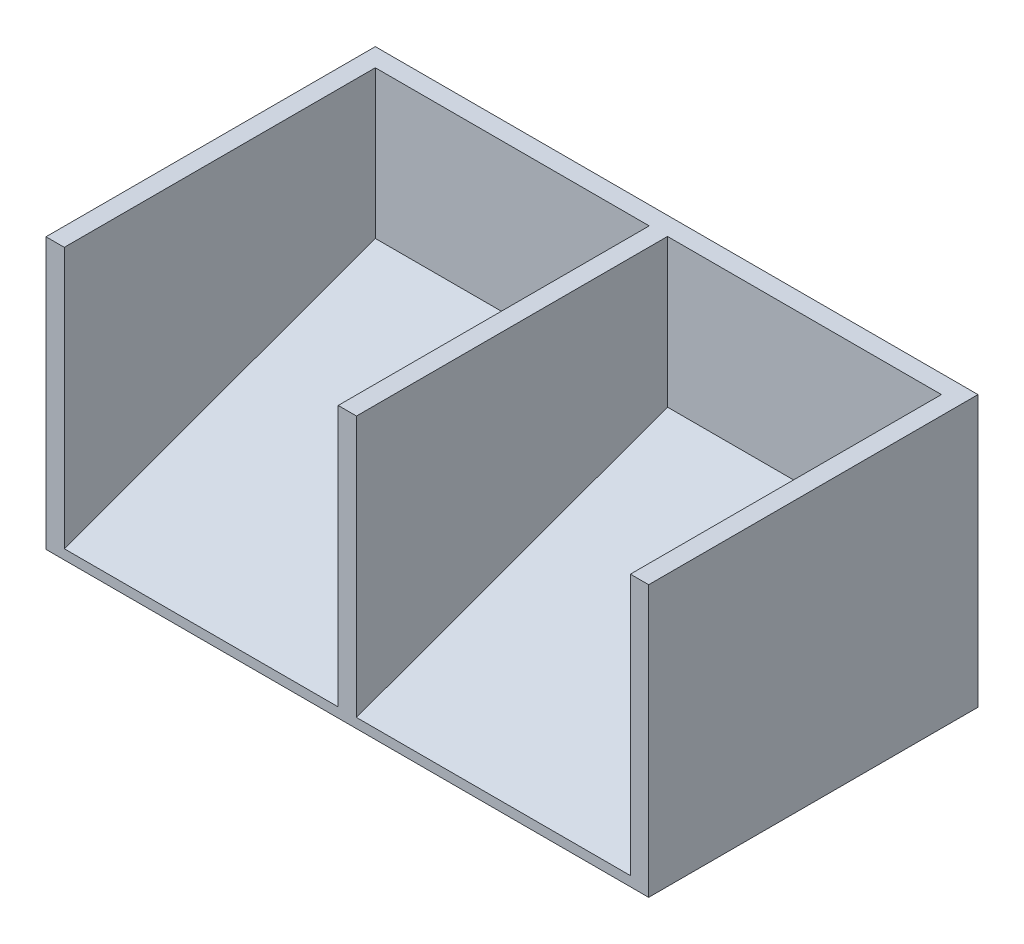
ISO-10303-21;
HEADER;
FILE_DESCRIPTION(('STEP AP214'),'2;1');
FILE_NAME('part.step','',(''),(''),'','','');
FILE_SCHEMA(('AUTOMOTIVE_DESIGN { 1 0 10303 214 1 1 1 1 }'));
ENDSEC;
DATA;
#1=APPLICATION_CONTEXT('core data for automotive mechanical design processes');
#2=APPLICATION_PROTOCOL_DEFINITION('international standard','automotive_design',2000,#1);
#3=PRODUCT_CONTEXT('',#1,'mechanical');
#4=PRODUCT('Part','Part','',(#3));
#5=PRODUCT_RELATED_PRODUCT_CATEGORY('part','',(#4));
#6=PRODUCT_DEFINITION_FORMATION('','',#4);
#7=PRODUCT_DEFINITION_CONTEXT('part definition',#1,'design');
#8=PRODUCT_DEFINITION('design','',#6,#7);
#9=PRODUCT_DEFINITION_SHAPE('','',#8);
#10=(LENGTH_UNIT() NAMED_UNIT(*) SI_UNIT(.MILLI.,.METRE.));
#11=(NAMED_UNIT(*) PLANE_ANGLE_UNIT() SI_UNIT($,.RADIAN.));
#12=(NAMED_UNIT(*) SI_UNIT($,.STERADIAN.) SOLID_ANGLE_UNIT());
#13=UNCERTAINTY_MEASURE_WITH_UNIT(LENGTH_MEASURE(1.E-05),#10,'distance_accuracy_value','');
#14=(GEOMETRIC_REPRESENTATION_CONTEXT(3) GLOBAL_UNCERTAINTY_ASSIGNED_CONTEXT((#13)) GLOBAL_UNIT_ASSIGNED_CONTEXT((#10,
#11,#12)) REPRESENTATION_CONTEXT('',''));
#15=CARTESIAN_POINT('',(0.,0.,0.));
#16=DIRECTION('',(0.,0.,1.));
#17=DIRECTION('',(1.,0.,0.));
#18=AXIS2_PLACEMENT_3D('',#15,#16,#17);
#19=CARTESIAN_POINT('',(104.5845,93.98,57.15));
#20=DIRECTION('',(-1.,0.,0.));
#21=DIRECTION('',(0.,0.,1.));
#22=AXIS2_PLACEMENT_3D('',#19,#20,#21);
#23=PLANE('',#22);
#24=DIRECTION('',(0.,0.,-1.));
#25=VECTOR('',#24,1.);
#26=CARTESIAN_POINT('',(104.5845,0.,57.15));
#27=LINE('',#26,#25);
#28=CARTESIAN_POINT('',(104.5845,0.,57.15));
#29=VERTEX_POINT('',#28);
#30=CARTESIAN_POINT('',(104.5845,0.,-57.15));
#31=VERTEX_POINT('',#30);
#32=EDGE_CURVE('E240',#29,#31,#27,.T.);
#33=ORIENTED_EDGE('',*,*,#32,.T.);
#34=DIRECTION('',(0.,-1.,0.));
#35=VECTOR('',#34,1.);
#36=CARTESIAN_POINT('',(104.5845,93.98,-57.15));
#37=LINE('',#36,#35);
#38=CARTESIAN_POINT('',(104.5845,93.98,-57.15));
#39=VERTEX_POINT('',#38);
#40=EDGE_CURVE('E12',#39,#31,#37,.T.);
#41=ORIENTED_EDGE('',*,*,#40,.F.);
#42=DIRECTION('',(0.,0.,-1.));
#43=VECTOR('',#42,1.);
#44=CARTESIAN_POINT('',(104.5845,93.98,57.15));
#45=LINE('',#44,#43);
#46=CARTESIAN_POINT('',(104.5845,93.98,57.15));
#47=VERTEX_POINT('',#46);
#48=EDGE_CURVE('E269',#47,#39,#45,.T.);
#49=ORIENTED_EDGE('',*,*,#48,.F.);
#50=DIRECTION('',(0.,-1.,0.));
#51=VECTOR('',#50,1.);
#52=CARTESIAN_POINT('',(104.5845,93.98,57.15));
#53=LINE('',#52,#51);
#54=EDGE_CURVE('E281',#47,#29,#53,.T.);
#55=ORIENTED_EDGE('',*,*,#54,.T.);
#56=EDGE_LOOP('',(#33,#41,#49,#55));
#57=FACE_BOUND('',#56,.T.);
#58=ADVANCED_FACE('F39',(#57),#23,.F.);
#59=CARTESIAN_POINT('',(-104.5845,93.98,-57.15));
#60=DIRECTION('',(0.,0.,1.));
#61=DIRECTION('',(1.,0.,0.));
#62=AXIS2_PLACEMENT_3D('',#59,#60,#61);
#63=PLANE('',#62);
#64=DIRECTION('',(-1.,0.,0.));
#65=VECTOR('',#64,1.);
#66=CARTESIAN_POINT('',(-104.5845,0.,-57.15));
#67=LINE('',#66,#65);
#68=CARTESIAN_POINT('',(-104.5845,0.,-57.15));
#69=VERTEX_POINT('',#68);
#70=EDGE_CURVE('E285',#31,#69,#67,.T.);
#71=ORIENTED_EDGE('',*,*,#70,.T.);
#72=DIRECTION('',(0.,-1.,0.));
#73=VECTOR('',#72,1.);
#74=CARTESIAN_POINT('',(-104.5845,93.98,-57.15));
#75=LINE('',#74,#73);
#76=CARTESIAN_POINT('',(-104.5845,93.98,-57.15));
#77=VERTEX_POINT('',#76);
#78=EDGE_CURVE('E46',#77,#69,#75,.T.);
#79=ORIENTED_EDGE('',*,*,#78,.F.);
#80=DIRECTION('',(-1.,0.,0.));
#81=VECTOR('',#80,1.);
#82=CARTESIAN_POINT('',(-104.5845,93.98,-57.15));
#83=LINE('',#82,#81);
#84=EDGE_CURVE('E272',#39,#77,#83,.T.);
#85=ORIENTED_EDGE('',*,*,#84,.F.);
#86=ORIENTED_EDGE('',*,*,#40,.T.);
#87=EDGE_LOOP('',(#71,#79,#85,#86));
#88=FACE_BOUND('',#87,.T.);
#89=ADVANCED_FACE('F322',(#88),#63,.F.);
#90=CARTESIAN_POINT('',(-104.5845,93.98,57.15));
#91=DIRECTION('',(1.,0.,0.));
#92=DIRECTION('',(0.,0.,-1.));
#93=AXIS2_PLACEMENT_3D('',#90,#91,#92);
#94=PLANE('',#93);
#95=DIRECTION('',(0.,0.,1.));
#96=VECTOR('',#95,1.);
#97=CARTESIAN_POINT('',(-104.5845,0.,57.15));
#98=LINE('',#97,#96);
#99=CARTESIAN_POINT('',(-104.5845,0.,57.15));
#100=VERTEX_POINT('',#99);
#101=EDGE_CURVE('E287',#69,#100,#98,.T.);
#102=ORIENTED_EDGE('',*,*,#101,.T.);
#103=DIRECTION('',(0.,-1.,0.));
#104=VECTOR('',#103,1.);
#105=CARTESIAN_POINT('',(-104.5845,93.98,57.15));
#106=LINE('',#105,#104);
#107=CARTESIAN_POINT('',(-104.5845,93.98,57.15));
#108=VERTEX_POINT('',#107);
#109=EDGE_CURVE('E295',#108,#100,#106,.T.);
#110=ORIENTED_EDGE('',*,*,#109,.F.);
#111=DIRECTION('',(0.,0.,1.));
#112=VECTOR('',#111,1.);
#113=CARTESIAN_POINT('',(-104.5845,93.98,57.15));
#114=LINE('',#113,#112);
#115=EDGE_CURVE('E275',#77,#108,#114,.T.);
#116=ORIENTED_EDGE('',*,*,#115,.F.);
#117=ORIENTED_EDGE('',*,*,#78,.T.);
#118=EDGE_LOOP('',(#102,#110,#116,#117));
#119=FACE_BOUND('',#118,.T.);
#120=ADVANCED_FACE('F302',(#119),#94,.F.);
#121=CARTESIAN_POINT('',(-104.5845,93.98,57.15));
#122=DIRECTION('',(0.,0.,-1.));
#123=DIRECTION('',(-1.,0.,0.));
#124=AXIS2_PLACEMENT_3D('',#121,#122,#123);
#125=PLANE('',#124);
#126=DIRECTION('',(1.,0.,0.));
#127=VECTOR('',#126,1.);
#128=CARTESIAN_POINT('',(-104.5845,93.98,57.15));
#129=LINE('',#128,#127);
#130=CARTESIAN_POINT('',(-3.175,93.98,57.15));
#131=VERTEX_POINT('',#130);
#132=CARTESIAN_POINT('',(3.17500000000002,93.98,57.15));
#133=VERTEX_POINT('',#132);
#134=EDGE_CURVE('E282',#131,#133,#129,.T.);
#135=ORIENTED_EDGE('',*,*,#134,.F.);
#136=DIRECTION('',(0.,1.,0.));
#137=VECTOR('',#136,1.);
#138=CARTESIAN_POINT('',(-3.175,-128.60504852733,57.15));
#139=LINE('',#138,#137);
#140=CARTESIAN_POINT('',(-3.175,3.37876442761104,57.15));
#141=VERTEX_POINT('',#140);
#142=EDGE_CURVE('E222',#141,#131,#139,.T.);
#143=ORIENTED_EDGE('',*,*,#142,.F.);
#144=DIRECTION('',(1.,0.,0.));
#145=VECTOR('',#144,1.);
#146=CARTESIAN_POINT('',(-98.2345,3.37876442761104,57.15));
#147=LINE('',#146,#145);
#148=CARTESIAN_POINT('',(-98.2345,3.37876442761104,57.15));
#149=VERTEX_POINT('',#148);
#150=EDGE_CURVE('E213',#149,#141,#147,.T.);
#151=ORIENTED_EDGE('',*,*,#150,.F.);
#152=DIRECTION('',(0.,1.,0.));
#153=VECTOR('',#152,1.);
#154=CARTESIAN_POINT('',(-98.2345,-128.60504852733,57.15));
#155=LINE('',#154,#153);
#156=CARTESIAN_POINT('',(-98.2345,93.98,57.15));
#157=VERTEX_POINT('',#156);
#158=EDGE_CURVE('E225',#149,#157,#155,.T.);
#159=ORIENTED_EDGE('',*,*,#158,.T.);
#160=EDGE_CURVE('E278',#108,#157,#129,.T.);
#161=ORIENTED_EDGE('',*,*,#160,.F.);
#162=ORIENTED_EDGE('',*,*,#109,.T.);
#163=DIRECTION('',(1.,0.,0.));
#164=VECTOR('',#163,1.);
#165=CARTESIAN_POINT('',(-104.5845,0.,57.15));
#166=LINE('',#165,#164);
#167=CARTESIAN_POINT('',(-98.2345,0.,57.15));
#168=VERTEX_POINT('',#167);
#169=EDGE_CURVE('E273',#100,#168,#166,.T.);
#170=ORIENTED_EDGE('',*,*,#169,.T.);
#171=DIRECTION('',(-1.,0.,0.));
#172=VECTOR('',#171,1.);
#173=CARTESIAN_POINT('',(-3.17500000000003,0.,57.15));
#174=LINE('',#173,#172);
#175=CARTESIAN_POINT('',(-3.17500000000003,0.,57.15));
#176=VERTEX_POINT('',#175);
#177=EDGE_CURVE('E202',#176,#168,#174,.T.);
#178=ORIENTED_EDGE('',*,*,#177,.F.);
#179=CARTESIAN_POINT('',(3.17499999999997,0.,57.15));
#180=VERTEX_POINT('',#179);
#181=EDGE_CURVE('E292',#176,#180,#166,.T.);
#182=ORIENTED_EDGE('',*,*,#181,.T.);
#183=DIRECTION('',(-1.,0.,0.));
#184=VECTOR('',#183,1.);
#185=CARTESIAN_POINT('',(98.2345,0.,57.15));
#186=LINE('',#185,#184);
#187=CARTESIAN_POINT('',(98.2345,0.,57.15));
#188=VERTEX_POINT('',#187);
#189=EDGE_CURVE('E183',#188,#180,#186,.T.);
#190=ORIENTED_EDGE('',*,*,#189,.F.);
#191=EDGE_CURVE('E289',#188,#29,#166,.T.);
#192=ORIENTED_EDGE('',*,*,#191,.T.);
#193=ORIENTED_EDGE('',*,*,#54,.F.);
#194=CARTESIAN_POINT('',(98.2345,93.98,57.15));
#195=VERTEX_POINT('',#194);
#196=EDGE_CURVE('E277',#195,#47,#129,.T.);
#197=ORIENTED_EDGE('',*,*,#196,.F.);
#198=DIRECTION('',(0.,1.,0.));
#199=VECTOR('',#198,1.);
#200=CARTESIAN_POINT('',(98.2345,-128.60504852733,57.15));
#201=LINE('',#200,#199);
#202=CARTESIAN_POINT('',(98.2345,3.37876442761104,57.15));
#203=VERTEX_POINT('',#202);
#204=EDGE_CURVE('E246',#203,#195,#201,.T.);
#205=ORIENTED_EDGE('',*,*,#204,.F.);
#206=DIRECTION('',(1.,0.,0.));
#207=VECTOR('',#206,1.);
#208=CARTESIAN_POINT('',(3.17500000000002,3.37876442761104,57.15));
#209=LINE('',#208,#207);
#210=CARTESIAN_POINT('',(3.17500000000002,3.37876442761104,57.15));
#211=VERTEX_POINT('',#210);
#212=EDGE_CURVE('E248',#211,#203,#209,.T.);
#213=ORIENTED_EDGE('',*,*,#212,.F.);
#214=DIRECTION('',(0.,1.,0.));
#215=VECTOR('',#214,1.);
#216=CARTESIAN_POINT('',(3.17500000000002,-128.60504852733,57.15));
#217=LINE('',#216,#215);
#218=EDGE_CURVE('E241',#211,#133,#217,.T.);
#219=ORIENTED_EDGE('',*,*,#218,.T.);
#220=EDGE_LOOP('',(#135,#143,#151,#159,#161,#162,#170,#178,#182,#190,#192,#193,#197,#205,#213,#219));
#221=FACE_BOUND('',#220,.T.);
#222=ADVANCED_FACE('F312',(#221),#125,.F.);
#223=CARTESIAN_POINT('',(0.,93.98,0.));
#224=DIRECTION('',(0.,-1.,0.));
#225=DIRECTION('',(0.,0.,-1.));
#226=AXIS2_PLACEMENT_3D('',#223,#224,#225);
#227=PLANE('',#226);
#228=DIRECTION('',(-1.,0.,0.));
#229=VECTOR('',#228,1.);
#230=CARTESIAN_POINT('',(-98.2345,93.98,-50.8));
#231=LINE('',#230,#229);
#232=CARTESIAN_POINT('',(-3.17500000000004,93.98,-50.8));
#233=VERTEX_POINT('',#232);
#234=CARTESIAN_POINT('',(-98.2345,93.98,-50.8));
#235=VERTEX_POINT('',#234);
#236=EDGE_CURVE('E211',#233,#235,#231,.T.);
#237=ORIENTED_EDGE('',*,*,#236,.F.);
#238=DIRECTION('',(0.,0.,-1.));
#239=VECTOR('',#238,1.);
#240=CARTESIAN_POINT('',(-3.175,93.98,57.15));
#241=LINE('',#240,#239);
#242=EDGE_CURVE('E214',#131,#233,#241,.T.);
#243=ORIENTED_EDGE('',*,*,#242,.F.);
#244=ORIENTED_EDGE('',*,*,#134,.T.);
#245=DIRECTION('',(0.,0.,1.));
#246=VECTOR('',#245,1.);
#247=CARTESIAN_POINT('',(3.17500000000002,93.98,57.15));
#248=LINE('',#247,#246);
#249=CARTESIAN_POINT('',(3.17500000000002,93.98,-50.8));
#250=VERTEX_POINT('',#249);
#251=EDGE_CURVE('E219',#250,#133,#248,.T.);
#252=ORIENTED_EDGE('',*,*,#251,.F.);
#253=DIRECTION('',(-1.,0.,0.));
#254=VECTOR('',#253,1.);
#255=CARTESIAN_POINT('',(3.17500000000002,93.98,-50.8));
#256=LINE('',#255,#254);
#257=CARTESIAN_POINT('',(98.2345,93.98,-50.8));
#258=VERTEX_POINT('',#257);
#259=EDGE_CURVE('E263',#258,#250,#256,.T.);
#260=ORIENTED_EDGE('',*,*,#259,.F.);
#261=DIRECTION('',(0.,0.,-1.));
#262=VECTOR('',#261,1.);
#263=CARTESIAN_POINT('',(98.2345,93.98,57.15));
#264=LINE('',#263,#262);
#265=EDGE_CURVE('E265',#195,#258,#264,.T.);
#266=ORIENTED_EDGE('',*,*,#265,.F.);
#267=ORIENTED_EDGE('',*,*,#196,.T.);
#268=ORIENTED_EDGE('',*,*,#48,.T.);
#269=ORIENTED_EDGE('',*,*,#84,.T.);
#270=ORIENTED_EDGE('',*,*,#115,.T.);
#271=ORIENTED_EDGE('',*,*,#160,.T.);
#272=DIRECTION('',(0.,0.,1.));
#273=VECTOR('',#272,1.);
#274=CARTESIAN_POINT('',(-98.2345,93.98,57.15));
#275=LINE('',#274,#273);
#276=EDGE_CURVE('E217',#235,#157,#275,.T.);
#277=ORIENTED_EDGE('',*,*,#276,.F.);
#278=EDGE_LOOP('',(#237,#243,#244,#252,#260,#266,#267,#268,#269,#270,#271,#277));
#279=FACE_BOUND('',#278,.T.);
#280=ADVANCED_FACE('F319',(#279),#227,.F.);
#281=CARTESIAN_POINT('',(0.,0.,0.));
#282=DIRECTION('',(0.,-1.,0.));
#283=DIRECTION('',(0.,0.,-1.));
#284=AXIS2_PLACEMENT_3D('',#281,#282,#283);
#285=PLANE('',#284);
#286=DIRECTION('',(0.,0.,-1.));
#287=VECTOR('',#286,1.);
#288=CARTESIAN_POINT('',(3.17499999999997,0.,57.15));
#289=LINE('',#288,#287);
#290=CARTESIAN_POINT('',(3.17499999999997,0.,-50.8));
#291=VERTEX_POINT('',#290);
#292=EDGE_CURVE('E176',#180,#291,#289,.T.);
#293=ORIENTED_EDGE('',*,*,#292,.F.);
#294=ORIENTED_EDGE('',*,*,#181,.F.);
#295=DIRECTION('',(0.,0.,1.));
#296=VECTOR('',#295,1.);
#297=CARTESIAN_POINT('',(-3.17500000000003,0.,57.15));
#298=LINE('',#297,#296);
#299=CARTESIAN_POINT('',(-3.17500000000003,0.,-50.8));
#300=VERTEX_POINT('',#299);
#301=EDGE_CURVE('E61',#300,#176,#298,.T.);
#302=ORIENTED_EDGE('',*,*,#301,.F.);
#303=DIRECTION('',(1.,0.,0.));
#304=VECTOR('',#303,1.);
#305=CARTESIAN_POINT('',(-3.17500000000003,0.,-50.8));
#306=LINE('',#305,#304);
#307=CARTESIAN_POINT('',(-98.2345,0.,-50.8));
#308=VERTEX_POINT('',#307);
#309=EDGE_CURVE('E193',#308,#300,#306,.T.);
#310=ORIENTED_EDGE('',*,*,#309,.F.);
#311=DIRECTION('',(0.,0.,-1.));
#312=VECTOR('',#311,1.);
#313=CARTESIAN_POINT('',(-98.2345,0.,57.15));
#314=LINE('',#313,#312);
#315=EDGE_CURVE('E199',#168,#308,#314,.T.);
#316=ORIENTED_EDGE('',*,*,#315,.F.);
#317=ORIENTED_EDGE('',*,*,#169,.F.);
#318=ORIENTED_EDGE('',*,*,#101,.F.);
#319=ORIENTED_EDGE('',*,*,#70,.F.);
#320=ORIENTED_EDGE('',*,*,#32,.F.);
#321=ORIENTED_EDGE('',*,*,#191,.F.);
#322=DIRECTION('',(0.,0.,1.));
#323=VECTOR('',#322,1.);
#324=CARTESIAN_POINT('',(98.2345,0.,57.15));
#325=LINE('',#324,#323);
#326=CARTESIAN_POINT('',(98.2345,0.,-50.8));
#327=VERTEX_POINT('',#326);
#328=EDGE_CURVE('E53',#327,#188,#325,.T.);
#329=ORIENTED_EDGE('',*,*,#328,.F.);
#330=DIRECTION('',(1.,0.,0.));
#331=VECTOR('',#330,1.);
#332=CARTESIAN_POINT('',(98.2345,0.,-50.8));
#333=LINE('',#332,#331);
#334=EDGE_CURVE('E168',#291,#327,#333,.T.);
#335=ORIENTED_EDGE('',*,*,#334,.F.);
#336=EDGE_LOOP('',(#293,#294,#302,#310,#316,#317,#318,#319,#320,#321,#329,#335));
#337=FACE_BOUND('',#336,.T.);
#338=ADVANCED_FACE('F185',(#337),#285,.T.);
#339=CARTESIAN_POINT('',(0.,21.3511800177881,7.77119399293423));
#340=DIRECTION('',(0.,-0.939692620785908,-0.342020143325669));
#341=DIRECTION('',(0.,0.342020143325669,-0.939692620785908));
#342=AXIS2_PLACEMENT_3D('',#339,#340,#341);
#343=PLANE('',#342);
#344=DIRECTION('',(0.,-0.342020143325669,0.939692620785908));
#345=VECTOR('',#344,1.);
#346=CARTESIAN_POINT('',(3.17500000000001,-12.0604088019659,99.5687798233109));
#347=LINE('',#346,#345);
#348=CARTESIAN_POINT('',(3.17500000000002,42.6693512166477,-50.8));
#349=VERTEX_POINT('',#348);
#350=EDGE_CURVE('E244',#349,#211,#347,.T.);
#351=ORIENTED_EDGE('',*,*,#350,.T.);
#352=ORIENTED_EDGE('',*,*,#212,.T.);
#353=DIRECTION('',(0.,0.342020143325669,-0.939692620785908));
#354=VECTOR('',#353,1.);
#355=CARTESIAN_POINT('',(98.2345,-12.0604088019659,99.5687798233109));
#356=LINE('',#355,#354);
#357=CARTESIAN_POINT('',(98.2345,42.6693512166477,-50.8));
#358=VERTEX_POINT('',#357);
#359=EDGE_CURVE('E249',#203,#358,#356,.T.);
#360=ORIENTED_EDGE('',*,*,#359,.T.);
#361=DIRECTION('',(-1.,0.,0.));
#362=VECTOR('',#361,1.);
#363=CARTESIAN_POINT('',(3.17500000000001,42.6693512166477,-50.8));
#364=LINE('',#363,#362);
#365=EDGE_CURVE('E252',#358,#349,#364,.T.);
#366=ORIENTED_EDGE('',*,*,#365,.T.);
#367=EDGE_LOOP('',(#351,#352,#360,#366));
#368=FACE_BOUND('',#367,.T.);
#369=ADVANCED_FACE('F353',(#368),#343,.F.);
#370=CARTESIAN_POINT('',(98.2345,-128.60504852733,57.15));
#371=DIRECTION('',(1.,0.,0.));
#372=DIRECTION('',(0.,0.,-1.));
#373=AXIS2_PLACEMENT_3D('',#370,#371,#372);
#374=PLANE('',#373);
#375=ORIENTED_EDGE('',*,*,#204,.T.);
#376=ORIENTED_EDGE('',*,*,#265,.T.);
#377=DIRECTION('',(0.,1.,0.));
#378=VECTOR('',#377,1.);
#379=CARTESIAN_POINT('',(98.2345,-128.60504852733,-50.8));
#380=LINE('',#379,#378);
#381=EDGE_CURVE('E250',#358,#258,#380,.T.);
#382=ORIENTED_EDGE('',*,*,#381,.F.);
#383=ORIENTED_EDGE('',*,*,#359,.F.);
#384=EDGE_LOOP('',(#375,#376,#382,#383));
#385=FACE_BOUND('',#384,.T.);
#386=ADVANCED_FACE('F364',(#385),#374,.F.);
#387=CARTESIAN_POINT('',(3.17500000000002,-128.60504852733,-50.8));
#388=DIRECTION('',(0.,0.,-1.));
#389=DIRECTION('',(-1.,0.,0.));
#390=AXIS2_PLACEMENT_3D('',#387,#388,#389);
#391=PLANE('',#390);
#392=ORIENTED_EDGE('',*,*,#381,.T.);
#393=ORIENTED_EDGE('',*,*,#259,.T.);
#394=DIRECTION('',(0.,1.,0.));
#395=VECTOR('',#394,1.);
#396=CARTESIAN_POINT('',(3.17500000000002,-128.60504852733,-50.8));
#397=LINE('',#396,#395);
#398=EDGE_CURVE('E253',#349,#250,#397,.T.);
#399=ORIENTED_EDGE('',*,*,#398,.F.);
#400=ORIENTED_EDGE('',*,*,#365,.F.);
#401=EDGE_LOOP('',(#392,#393,#399,#400));
#402=FACE_BOUND('',#401,.T.);
#403=ADVANCED_FACE('F360',(#402),#391,.F.);
#404=CARTESIAN_POINT('',(3.17500000000002,-128.60504852733,57.15));
#405=DIRECTION('',(-1.,0.,0.));
#406=DIRECTION('',(0.,0.,1.));
#407=AXIS2_PLACEMENT_3D('',#404,#405,#406);
#408=PLANE('',#407);
#409=ORIENTED_EDGE('',*,*,#398,.T.);
#410=ORIENTED_EDGE('',*,*,#251,.T.);
#411=ORIENTED_EDGE('',*,*,#218,.F.);
#412=ORIENTED_EDGE('',*,*,#350,.F.);
#413=EDGE_LOOP('',(#409,#410,#411,#412));
#414=FACE_BOUND('',#413,.T.);
#415=ADVANCED_FACE('F356',(#414),#408,.F.);
#416=CARTESIAN_POINT('',(0.,21.3511800177881,7.77119399293423));
#417=DIRECTION('',(0.,-0.939692620785908,-0.342020143325669));
#418=DIRECTION('',(0.,0.342020143325669,-0.939692620785908));
#419=AXIS2_PLACEMENT_3D('',#416,#417,#418);
#420=PLANE('',#419);
#421=DIRECTION('',(0.,-0.342020143325669,0.939692620785908));
#422=VECTOR('',#421,1.);
#423=CARTESIAN_POINT('',(-98.2345,-12.0604088019659,99.5687798233109));
#424=LINE('',#423,#422);
#425=CARTESIAN_POINT('',(-98.2345,42.6693512166477,-50.8));
#426=VERTEX_POINT('',#425);
#427=EDGE_CURVE('E223',#426,#149,#424,.T.);
#428=ORIENTED_EDGE('',*,*,#427,.T.);
#429=ORIENTED_EDGE('',*,*,#150,.T.);
#430=DIRECTION('',(0.,0.342020143325669,-0.939692620785908));
#431=VECTOR('',#430,1.);
#432=CARTESIAN_POINT('',(-3.17499999999998,-12.0604088019659,99.5687798233109));
#433=LINE('',#432,#431);
#434=CARTESIAN_POINT('',(-3.17500000000004,42.6693512166476,-50.8));
#435=VERTEX_POINT('',#434);
#436=EDGE_CURVE('E231',#141,#435,#433,.T.);
#437=ORIENTED_EDGE('',*,*,#436,.T.);
#438=DIRECTION('',(-1.,0.,0.));
#439=VECTOR('',#438,1.);
#440=CARTESIAN_POINT('',(-98.2345,42.6693512166477,-50.8));
#441=LINE('',#440,#439);
#442=EDGE_CURVE('E227',#435,#426,#441,.T.);
#443=ORIENTED_EDGE('',*,*,#442,.T.);
#444=EDGE_LOOP('',(#428,#429,#437,#443));
#445=FACE_BOUND('',#444,.T.);
#446=ADVANCED_FACE('F359',(#445),#420,.F.);
#447=CARTESIAN_POINT('',(-3.175,-128.60504852733,57.15));
#448=DIRECTION('',(1.,0.,0.));
#449=DIRECTION('',(0.,0.,-1.));
#450=AXIS2_PLACEMENT_3D('',#447,#448,#449);
#451=PLANE('',#450);
#452=ORIENTED_EDGE('',*,*,#142,.T.);
#453=ORIENTED_EDGE('',*,*,#242,.T.);
#454=DIRECTION('',(0.,1.,0.));
#455=VECTOR('',#454,1.);
#456=CARTESIAN_POINT('',(-3.17500000000004,-128.60504852733,-50.8));
#457=LINE('',#456,#455);
#458=EDGE_CURVE('E230',#435,#233,#457,.T.);
#459=ORIENTED_EDGE('',*,*,#458,.F.);
#460=ORIENTED_EDGE('',*,*,#436,.F.);
#461=EDGE_LOOP('',(#452,#453,#459,#460));
#462=FACE_BOUND('',#461,.T.);
#463=ADVANCED_FACE('F374',(#462),#451,.F.);
#464=CARTESIAN_POINT('',(-98.2345,-128.60504852733,-50.8));
#465=DIRECTION('',(0.,0.,-1.));
#466=DIRECTION('',(-1.,0.,0.));
#467=AXIS2_PLACEMENT_3D('',#464,#465,#466);
#468=PLANE('',#467);
#469=ORIENTED_EDGE('',*,*,#458,.T.);
#470=ORIENTED_EDGE('',*,*,#236,.T.);
#471=DIRECTION('',(0.,1.,0.));
#472=VECTOR('',#471,1.);
#473=CARTESIAN_POINT('',(-98.2345,-128.60504852733,-50.8));
#474=LINE('',#473,#472);
#475=EDGE_CURVE('E226',#426,#235,#474,.T.);
#476=ORIENTED_EDGE('',*,*,#475,.F.);
#477=ORIENTED_EDGE('',*,*,#442,.F.);
#478=EDGE_LOOP('',(#469,#470,#476,#477));
#479=FACE_BOUND('',#478,.T.);
#480=ADVANCED_FACE('F378',(#479),#468,.F.);
#481=CARTESIAN_POINT('',(-98.2345,-128.60504852733,57.15));
#482=DIRECTION('',(-1.,0.,0.));
#483=DIRECTION('',(0.,0.,1.));
#484=AXIS2_PLACEMENT_3D('',#481,#482,#483);
#485=PLANE('',#484);
#486=ORIENTED_EDGE('',*,*,#475,.T.);
#487=ORIENTED_EDGE('',*,*,#276,.T.);
#488=ORIENTED_EDGE('',*,*,#158,.F.);
#489=ORIENTED_EDGE('',*,*,#427,.F.);
#490=EDGE_LOOP('',(#486,#487,#488,#489));
#491=FACE_BOUND('',#490,.T.);
#492=ADVANCED_FACE('F382',(#491),#485,.F.);
#493=CARTESIAN_POINT('',(-98.2345,168.099399743977,57.15));
#494=DIRECTION('',(-1.,0.,0.));
#495=DIRECTION('',(0.,0.,1.));
#496=AXIS2_PLACEMENT_3D('',#493,#494,#495);
#497=PLANE('',#496);
#498=DIRECTION('',(0.,-0.342020143325669,0.939692620785908));
#499=VECTOR('',#498,1.);
#500=CARTESIAN_POINT('',(-98.2345,19.663894339234,3.12389432441328));
#501=LINE('',#500,#499);
#502=CARTESIAN_POINT('',(-98.2345,39.2905867890366,-50.8));
#503=VERTEX_POINT('',#502);
#504=EDGE_CURVE('E196',#503,#168,#501,.T.);
#505=ORIENTED_EDGE('',*,*,#504,.T.);
#506=ORIENTED_EDGE('',*,*,#315,.T.);
#507=DIRECTION('',(0.,-1.,0.));
#508=VECTOR('',#507,1.);
#509=CARTESIAN_POINT('',(-98.2345,168.099399743977,-50.8));
#510=LINE('',#509,#508);
#511=EDGE_CURVE('E191',#503,#308,#510,.T.);
#512=ORIENTED_EDGE('',*,*,#511,.F.);
#513=EDGE_LOOP('',(#505,#506,#512));
#514=FACE_BOUND('',#513,.T.);
#515=ADVANCED_FACE('F386',(#514),#497,.F.);
#516=CARTESIAN_POINT('',(-3.17500000000003,168.099399743977,-50.8));
#517=DIRECTION('',(0.,0.,-1.));
#518=DIRECTION('',(-1.,0.,0.));
#519=AXIS2_PLACEMENT_3D('',#516,#517,#518);
#520=PLANE('',#519);
#521=DIRECTION('',(-1.,0.,0.));
#522=VECTOR('',#521,1.);
#523=CARTESIAN_POINT('',(-3.17500000000002,39.2905867890366,-50.8));
#524=LINE('',#523,#522);
#525=CARTESIAN_POINT('',(-3.17500000000003,39.2905867890366,-50.8));
#526=VERTEX_POINT('',#525);
#527=EDGE_CURVE('E208',#526,#503,#524,.T.);
#528=ORIENTED_EDGE('',*,*,#527,.T.);
#529=ORIENTED_EDGE('',*,*,#511,.T.);
#530=ORIENTED_EDGE('',*,*,#309,.T.);
#531=DIRECTION('',(0.,-1.,0.));
#532=VECTOR('',#531,1.);
#533=CARTESIAN_POINT('',(-3.17500000000003,168.099399743977,-50.8));
#534=LINE('',#533,#532);
#535=EDGE_CURVE('E194',#526,#300,#534,.T.);
#536=ORIENTED_EDGE('',*,*,#535,.F.);
#537=EDGE_LOOP('',(#528,#529,#530,#536));
#538=FACE_BOUND('',#537,.T.);
#539=ADVANCED_FACE('F393',(#538),#520,.F.);
#540=CARTESIAN_POINT('',(-3.17500000000003,168.099399743977,57.15));
#541=DIRECTION('',(1.,0.,0.));
#542=DIRECTION('',(0.,0.,-1.));
#543=AXIS2_PLACEMENT_3D('',#540,#541,#542);
#544=PLANE('',#543);
#545=DIRECTION('',(0.,0.342020143325669,-0.939692620785908));
#546=VECTOR('',#545,1.);
#547=CARTESIAN_POINT('',(-3.17500000000003,19.663894339234,3.12389432441328));
#548=LINE('',#547,#546);
#549=EDGE_CURVE('E206',#176,#526,#548,.T.);
#550=ORIENTED_EDGE('',*,*,#549,.T.);
#551=ORIENTED_EDGE('',*,*,#535,.T.);
#552=ORIENTED_EDGE('',*,*,#301,.T.);
#553=EDGE_LOOP('',(#550,#551,#552));
#554=FACE_BOUND('',#553,.T.);
#555=ADVANCED_FACE('F391',(#554),#544,.F.);
#556=CARTESIAN_POINT('',(0.,18.3676559467929,6.68528003787523));
#557=DIRECTION('',(0.,-0.939692620785908,-0.342020143325669));
#558=DIRECTION('',(0.,0.342020143325669,-0.939692620785908));
#559=AXIS2_PLACEMENT_3D('',#556,#557,#558);
#560=PLANE('',#559);
#561=ORIENTED_EDGE('',*,*,#549,.F.);
#562=ORIENTED_EDGE('',*,*,#177,.T.);
#563=ORIENTED_EDGE('',*,*,#504,.F.);
#564=ORIENTED_EDGE('',*,*,#527,.F.);
#565=EDGE_LOOP('',(#561,#562,#563,#564));
#566=FACE_BOUND('',#565,.T.);
#567=ADVANCED_FACE('F388',(#566),#560,.T.);
#568=CARTESIAN_POINT('',(3.17499999999997,168.099399743977,57.15));
#569=DIRECTION('',(-1.,0.,0.));
#570=DIRECTION('',(0.,0.,1.));
#571=AXIS2_PLACEMENT_3D('',#568,#569,#570);
#572=PLANE('',#571);
#573=DIRECTION('',(0.,-0.342020143325669,0.939692620785908));
#574=VECTOR('',#573,1.);
#575=CARTESIAN_POINT('',(3.17499999999997,19.663894339234,3.12389432441328));
#576=LINE('',#575,#574);
#577=CARTESIAN_POINT('',(3.17499999999997,39.2905867890367,-50.8));
#578=VERTEX_POINT('',#577);
#579=EDGE_CURVE('E178',#578,#180,#576,.T.);
#580=ORIENTED_EDGE('',*,*,#579,.T.);
#581=ORIENTED_EDGE('',*,*,#292,.T.);
#582=DIRECTION('',(0.,-1.,0.));
#583=VECTOR('',#582,1.);
#584=CARTESIAN_POINT('',(3.17499999999997,168.099399743977,-50.8));
#585=LINE('',#584,#583);
#586=EDGE_CURVE('E163',#578,#291,#585,.T.);
#587=ORIENTED_EDGE('',*,*,#586,.F.);
#588=EDGE_LOOP('',(#580,#581,#587));
#589=FACE_BOUND('',#588,.T.);
#590=ADVANCED_FACE('F177',(#589),#572,.F.);
#591=CARTESIAN_POINT('',(98.2345,168.099399743977,-50.8));
#592=DIRECTION('',(0.,0.,-1.));
#593=DIRECTION('',(-1.,0.,0.));
#594=AXIS2_PLACEMENT_3D('',#591,#592,#593);
#595=PLANE('',#594);
#596=DIRECTION('',(-1.,0.,0.));
#597=VECTOR('',#596,1.);
#598=CARTESIAN_POINT('',(98.2345,39.2905867890366,-50.8));
#599=LINE('',#598,#597);
#600=CARTESIAN_POINT('',(98.2345,39.2905867890366,-50.8));
#601=VERTEX_POINT('',#600);
#602=EDGE_CURVE('E170',#601,#578,#599,.T.);
#603=ORIENTED_EDGE('',*,*,#602,.T.);
#604=ORIENTED_EDGE('',*,*,#586,.T.);
#605=ORIENTED_EDGE('',*,*,#334,.T.);
#606=DIRECTION('',(0.,-1.,0.));
#607=VECTOR('',#606,1.);
#608=CARTESIAN_POINT('',(98.2345,168.099399743977,-50.8));
#609=LINE('',#608,#607);
#610=EDGE_CURVE('E173',#601,#327,#609,.T.);
#611=ORIENTED_EDGE('',*,*,#610,.F.);
#612=EDGE_LOOP('',(#603,#604,#605,#611));
#613=FACE_BOUND('',#612,.T.);
#614=ADVANCED_FACE('F165',(#613),#595,.F.);
#615=CARTESIAN_POINT('',(98.2345,168.099399743977,57.15));
#616=DIRECTION('',(1.,0.,0.));
#617=DIRECTION('',(0.,0.,-1.));
#618=AXIS2_PLACEMENT_3D('',#615,#616,#617);
#619=PLANE('',#618);
#620=DIRECTION('',(0.,0.342020143325669,-0.939692620785908));
#621=VECTOR('',#620,1.);
#622=CARTESIAN_POINT('',(98.2345,19.663894339234,3.12389432441328));
#623=LINE('',#622,#621);
#624=EDGE_CURVE('E245',#188,#601,#623,.T.);
#625=ORIENTED_EDGE('',*,*,#624,.T.);
#626=ORIENTED_EDGE('',*,*,#610,.T.);
#627=ORIENTED_EDGE('',*,*,#328,.T.);
#628=EDGE_LOOP('',(#625,#626,#627));
#629=FACE_BOUND('',#628,.T.);
#630=ADVANCED_FACE('F331',(#629),#619,.F.);
#631=CARTESIAN_POINT('',(0.,18.3676559467929,6.68528003787523));
#632=DIRECTION('',(0.,-0.939692620785908,-0.342020143325669));
#633=DIRECTION('',(0.,0.342020143325669,-0.939692620785908));
#634=AXIS2_PLACEMENT_3D('',#631,#632,#633);
#635=PLANE('',#634);
#636=ORIENTED_EDGE('',*,*,#624,.F.);
#637=ORIENTED_EDGE('',*,*,#189,.T.);
#638=ORIENTED_EDGE('',*,*,#579,.F.);
#639=ORIENTED_EDGE('',*,*,#602,.F.);
#640=EDGE_LOOP('',(#636,#637,#638,#639));
#641=FACE_BOUND('',#640,.T.);
#642=ADVANCED_FACE('F332',(#641),#635,.T.);
#643=CLOSED_SHELL('',(#58,#89,#120,#222,#280,#338,#369,#386,#403,#415,#446,#463,#480,#492,#515,
#539,#555,#567,#590,#614,#630,#642));
#644=MANIFOLD_SOLID_BREP('B2',#643);
#645=ADVANCED_BREP_SHAPE_REPRESENTATION('',(#18,#644),#14);
#646=SHAPE_DEFINITION_REPRESENTATION(#9,#645);
ENDSEC;
END-ISO-10303-21;
